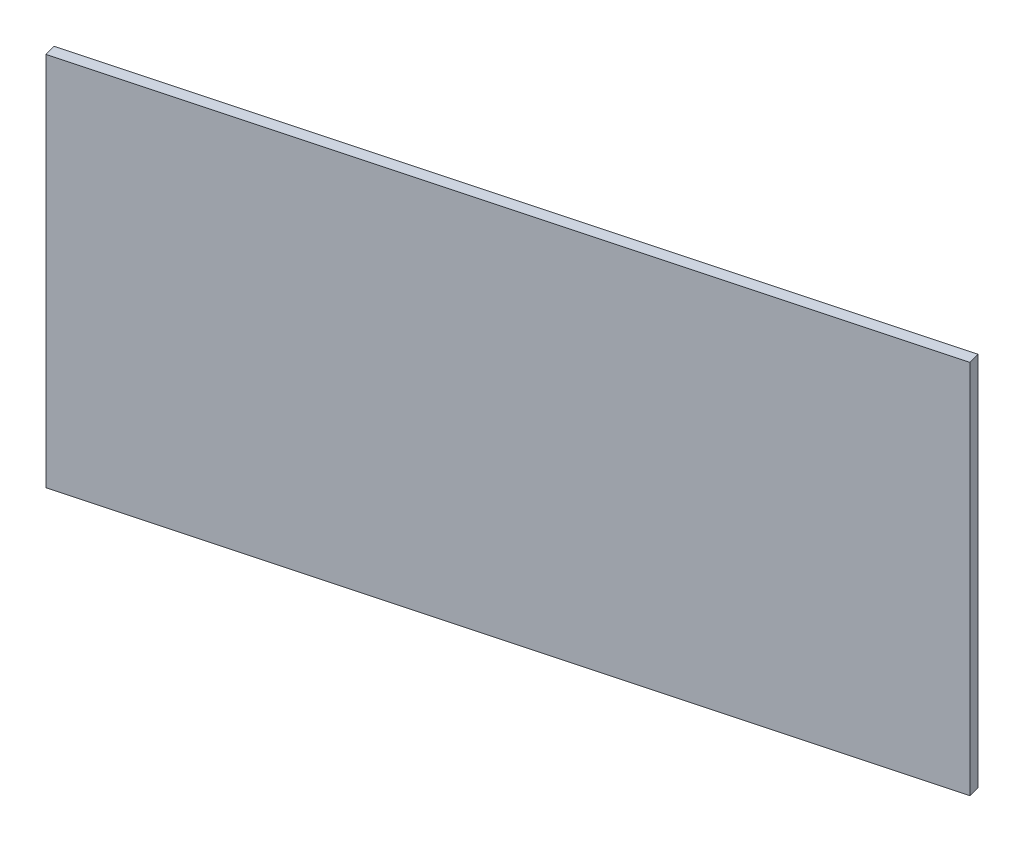
ISO-10303-21;
HEADER;
FILE_DESCRIPTION(('STEP AP214'),'2;1');
FILE_NAME('part.step','',(''),(''),'','','');
FILE_SCHEMA(('AUTOMOTIVE_DESIGN { 1 0 10303 214 1 1 1 1 }'));
ENDSEC;
DATA;
#1=APPLICATION_CONTEXT('core data for automotive mechanical design processes');
#2=APPLICATION_PROTOCOL_DEFINITION('international standard','automotive_design',2000,#1);
#3=PRODUCT_CONTEXT('',#1,'mechanical');
#4=PRODUCT('Part','Part','',(#3));
#5=PRODUCT_RELATED_PRODUCT_CATEGORY('part','',(#4));
#6=PRODUCT_DEFINITION_FORMATION('','',#4);
#7=PRODUCT_DEFINITION_CONTEXT('part definition',#1,'design');
#8=PRODUCT_DEFINITION('design','',#6,#7);
#9=PRODUCT_DEFINITION_SHAPE('','',#8);
#10=(LENGTH_UNIT() NAMED_UNIT(*) SI_UNIT(.MILLI.,.METRE.));
#11=(NAMED_UNIT(*) PLANE_ANGLE_UNIT() SI_UNIT($,.RADIAN.));
#12=(NAMED_UNIT(*) SI_UNIT($,.STERADIAN.) SOLID_ANGLE_UNIT());
#13=UNCERTAINTY_MEASURE_WITH_UNIT(LENGTH_MEASURE(1.E-05),#10,'distance_accuracy_value','');
#14=(GEOMETRIC_REPRESENTATION_CONTEXT(3) GLOBAL_UNCERTAINTY_ASSIGNED_CONTEXT((#13)) GLOBAL_UNIT_ASSIGNED_CONTEXT((#10,
#11,#12)) REPRESENTATION_CONTEXT('',''));
#15=CARTESIAN_POINT('',(0.,0.,0.));
#16=DIRECTION('',(0.,0.,1.));
#17=DIRECTION('',(1.,0.,0.));
#18=AXIS2_PLACEMENT_3D('',#15,#16,#17);
#19=CARTESIAN_POINT('',(-1096.143145767,-567.,2454.922123761));
#20=DIRECTION('',(0.258819045102985,0.,0.965925826288944));
#21=DIRECTION('',(0.,-1.,0.));
#22=AXIS2_PLACEMENT_3D('',#19,#20,#21);
#23=PLANE('',#22);
#24=DIRECTION('',(0.,1.,0.));
#25=VECTOR('',#24,1.);
#26=CARTESIAN_POINT('',(-1096.143145767,-567.,2454.922123761));
#27=LINE('',#26,#25);
#28=CARTESIAN_POINT('',(-1096.143145767,-567.,2454.922123761));
#29=VERTEX_POINT('',#28);
#30=CARTESIAN_POINT('',(-1096.143145767,567.,2454.922123761));
#31=VERTEX_POINT('',#30);
#32=EDGE_CURVE('E89',#29,#31,#27,.T.);
#33=ORIENTED_EDGE('',*,*,#32,.F.);
#34=DIRECTION('',(0.965925826288944,0.,-0.258819045102985));
#35=VECTOR('',#34,1.);
#36=CARTESIAN_POINT('',(-1096.143145767,-567.,2454.922123761));
#37=LINE('',#36,#35);
#38=CARTESIAN_POINT('',(1105.201812346,-567.,1865.073519972));
#39=VERTEX_POINT('',#38);
#40=EDGE_CURVE('E72',#29,#39,#37,.T.);
#41=ORIENTED_EDGE('',*,*,#40,.T.);
#42=DIRECTION('',(0.,1.,0.));
#43=VECTOR('',#42,1.);
#44=CARTESIAN_POINT('',(1105.201812346,-567.,1865.073519972));
#45=LINE('',#44,#43);
#46=CARTESIAN_POINT('',(1105.201812346,567.,1865.073519972));
#47=VERTEX_POINT('',#46);
#48=EDGE_CURVE('E83',#39,#47,#45,.T.);
#49=ORIENTED_EDGE('',*,*,#48,.T.);
#50=DIRECTION('',(0.965925826288944,0.,-0.258819045102985));
#51=VECTOR('',#50,1.);
#52=CARTESIAN_POINT('',(-1096.143145767,567.,2454.922123761));
#53=LINE('',#52,#51);
#54=EDGE_CURVE('E11',#31,#47,#53,.T.);
#55=ORIENTED_EDGE('',*,*,#54,.F.);
#56=EDGE_LOOP('',(#33,#41,#49,#55));
#57=FACE_BOUND('',#56,.T.);
#58=ADVANCED_FACE('F17',(#57),#23,.T.);
#59=CARTESIAN_POINT('',(-1105.201812346,-567.,2421.114719841));
#60=DIRECTION('',(0.258819045102985,0.,0.965925826288944));
#61=DIRECTION('',(0.,-1.,0.));
#62=AXIS2_PLACEMENT_3D('',#59,#60,#61);
#63=PLANE('',#62);
#64=DIRECTION('',(0.965925826288944,0.,-0.258819045102985));
#65=VECTOR('',#64,1.);
#66=CARTESIAN_POINT('',(-1105.201812346,567.,2421.114719841));
#67=LINE('',#66,#65);
#68=CARTESIAN_POINT('',(-1105.201812346,567.,2421.114719841));
#69=VERTEX_POINT('',#68);
#70=CARTESIAN_POINT('',(1096.143145767,567.,1831.266116052));
#71=VERTEX_POINT('',#70);
#72=EDGE_CURVE('E26',#69,#71,#67,.T.);
#73=ORIENTED_EDGE('',*,*,#72,.T.);
#74=DIRECTION('',(0.,1.,0.));
#75=VECTOR('',#74,1.);
#76=CARTESIAN_POINT('',(1096.143145767,-567.,1831.266116052));
#77=LINE('',#76,#75);
#78=CARTESIAN_POINT('',(1096.143145767,-567.,1831.266116052));
#79=VERTEX_POINT('',#78);
#80=EDGE_CURVE('E106',#79,#71,#77,.T.);
#81=ORIENTED_EDGE('',*,*,#80,.F.);
#82=DIRECTION('',(0.965925826288944,0.,-0.258819045102985));
#83=VECTOR('',#82,1.);
#84=CARTESIAN_POINT('',(-1105.201812346,-567.,2421.114719841));
#85=LINE('',#84,#83);
#86=CARTESIAN_POINT('',(-1105.201812346,-567.,2421.114719841));
#87=VERTEX_POINT('',#86);
#88=EDGE_CURVE('E20',#87,#79,#85,.T.);
#89=ORIENTED_EDGE('',*,*,#88,.F.);
#90=DIRECTION('',(0.,1.,0.));
#91=VECTOR('',#90,1.);
#92=CARTESIAN_POINT('',(-1105.201812346,-567.,2421.114719841));
#93=LINE('',#92,#91);
#94=EDGE_CURVE('E90',#87,#69,#93,.T.);
#95=ORIENTED_EDGE('',*,*,#94,.T.);
#96=EDGE_LOOP('',(#73,#81,#89,#95));
#97=FACE_BOUND('',#96,.T.);
#98=ADVANCED_FACE('F121',(#97),#63,.F.);
#99=CARTESIAN_POINT('',(-1105.201812346,567.,2421.114719841));
#100=DIRECTION('',(0.,1.,0.));
#101=DIRECTION('',(1.,0.,0.));
#102=AXIS2_PLACEMENT_3D('',#99,#100,#101);
#103=PLANE('',#102);
#104=ORIENTED_EDGE('',*,*,#72,.F.);
#105=DIRECTION('',(0.258819045102985,0.,0.965925826288944));
#106=VECTOR('',#105,1.);
#107=CARTESIAN_POINT('',(-1105.201812346,567.,2421.114719841));
#108=LINE('',#107,#106);
#109=EDGE_CURVE('E94',#69,#31,#108,.T.);
#110=ORIENTED_EDGE('',*,*,#109,.T.);
#111=ORIENTED_EDGE('',*,*,#54,.T.);
#112=DIRECTION('',(0.258819045102985,0.,0.965925826288944));
#113=VECTOR('',#112,1.);
#114=CARTESIAN_POINT('',(1096.143145767,567.,1831.266116052));
#115=LINE('',#114,#113);
#116=EDGE_CURVE('E102',#71,#47,#115,.T.);
#117=ORIENTED_EDGE('',*,*,#116,.F.);
#118=EDGE_LOOP('',(#104,#110,#111,#117));
#119=FACE_BOUND('',#118,.T.);
#120=ADVANCED_FACE('F120',(#119),#103,.T.);
#121=CARTESIAN_POINT('',(-1105.201812346,-567.,2421.114719841));
#122=DIRECTION('',(0.,1.,0.));
#123=DIRECTION('',(1.,0.,0.));
#124=AXIS2_PLACEMENT_3D('',#121,#122,#123);
#125=PLANE('',#124);
#126=DIRECTION('',(0.258819045102985,0.,0.965925826288944));
#127=VECTOR('',#126,1.);
#128=CARTESIAN_POINT('',(1096.143145767,-567.,1831.266116052));
#129=LINE('',#128,#127);
#130=EDGE_CURVE('E78',#79,#39,#129,.T.);
#131=ORIENTED_EDGE('',*,*,#130,.T.);
#132=ORIENTED_EDGE('',*,*,#40,.F.);
#133=DIRECTION('',(0.258819045102985,0.,0.965925826288944));
#134=VECTOR('',#133,1.);
#135=CARTESIAN_POINT('',(-1105.201812346,-567.,2421.114719841));
#136=LINE('',#135,#134);
#137=EDGE_CURVE('E75',#87,#29,#136,.T.);
#138=ORIENTED_EDGE('',*,*,#137,.F.);
#139=ORIENTED_EDGE('',*,*,#88,.T.);
#140=EDGE_LOOP('',(#131,#132,#138,#139));
#141=FACE_BOUND('',#140,.T.);
#142=ADVANCED_FACE('F74',(#141),#125,.F.);
#143=CARTESIAN_POINT('',(1096.143145767,-567.,1831.266116052));
#144=DIRECTION('',(0.965925826288944,0.,-0.258819045102985));
#145=DIRECTION('',(0.,-1.,0.));
#146=AXIS2_PLACEMENT_3D('',#143,#144,#145);
#147=PLANE('',#146);
#148=ORIENTED_EDGE('',*,*,#130,.F.);
#149=ORIENTED_EDGE('',*,*,#80,.T.);
#150=ORIENTED_EDGE('',*,*,#116,.T.);
#151=ORIENTED_EDGE('',*,*,#48,.F.);
#152=EDGE_LOOP('',(#148,#149,#150,#151));
#153=FACE_BOUND('',#152,.T.);
#154=ADVANCED_FACE('F119',(#153),#147,.T.);
#155=CARTESIAN_POINT('',(-1105.201812346,-567.,2421.114719841));
#156=DIRECTION('',(0.965925826288944,0.,-0.258819045102985));
#157=DIRECTION('',(0.,-1.,0.));
#158=AXIS2_PLACEMENT_3D('',#155,#156,#157);
#159=PLANE('',#158);
#160=ORIENTED_EDGE('',*,*,#32,.T.);
#161=ORIENTED_EDGE('',*,*,#109,.F.);
#162=ORIENTED_EDGE('',*,*,#94,.F.);
#163=ORIENTED_EDGE('',*,*,#137,.T.);
#164=EDGE_LOOP('',(#160,#161,#162,#163));
#165=FACE_BOUND('',#164,.T.);
#166=ADVANCED_FACE('F87',(#165),#159,.F.);
#167=CLOSED_SHELL('',(#58,#98,#120,#142,#154,#166));
#168=MANIFOLD_SOLID_BREP('B1',#167);
#169=ADVANCED_BREP_SHAPE_REPRESENTATION('',(#18,#168),#14);
#170=SHAPE_DEFINITION_REPRESENTATION(#9,#169);
ENDSEC;
END-ISO-10303-21;
